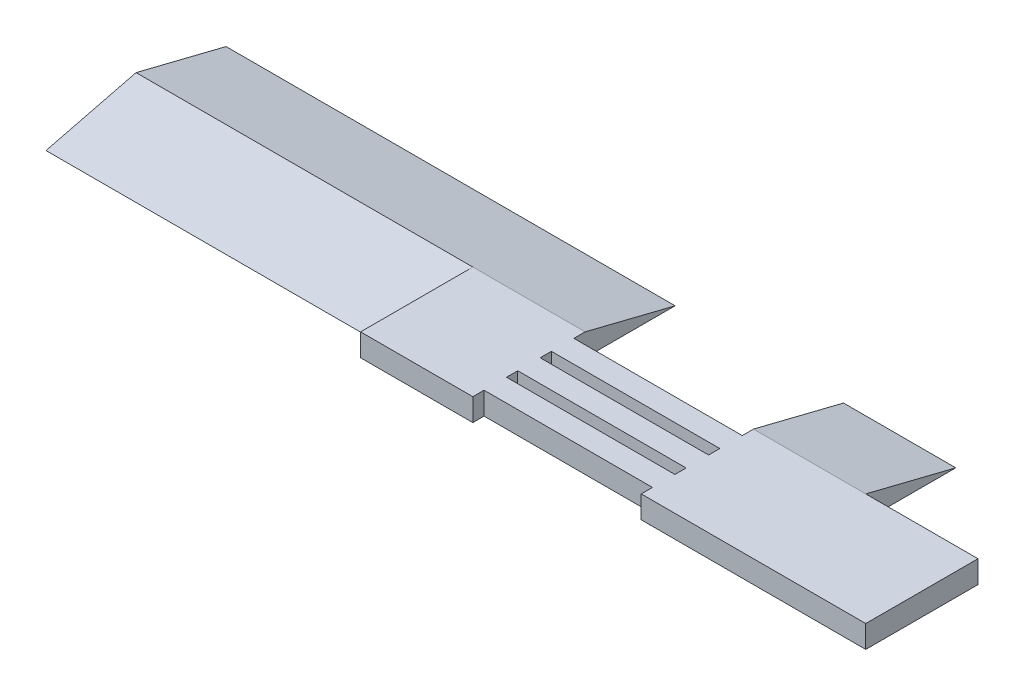
ISO-10303-21;
HEADER;
FILE_DESCRIPTION(('STEP AP214'),'2;1');
FILE_NAME('part.step','',(''),(''),'','','');
FILE_SCHEMA(('AUTOMOTIVE_DESIGN { 1 0 10303 214 1 1 1 1 }'));
ENDSEC;
DATA;
#1=APPLICATION_CONTEXT('core data for automotive mechanical design processes');
#2=APPLICATION_PROTOCOL_DEFINITION('international standard','automotive_design',2000,#1);
#3=PRODUCT_CONTEXT('',#1,'mechanical');
#4=PRODUCT('Part','Part','',(#3));
#5=PRODUCT_RELATED_PRODUCT_CATEGORY('part','',(#4));
#6=PRODUCT_DEFINITION_FORMATION('','',#4);
#7=PRODUCT_DEFINITION_CONTEXT('part definition',#1,'design');
#8=PRODUCT_DEFINITION('design','',#6,#7);
#9=PRODUCT_DEFINITION_SHAPE('','',#8);
#10=(LENGTH_UNIT() NAMED_UNIT(*) SI_UNIT(.MILLI.,.METRE.));
#11=(NAMED_UNIT(*) PLANE_ANGLE_UNIT() SI_UNIT($,.RADIAN.));
#12=(NAMED_UNIT(*) SI_UNIT($,.STERADIAN.) SOLID_ANGLE_UNIT());
#13=UNCERTAINTY_MEASURE_WITH_UNIT(LENGTH_MEASURE(1.E-05),#10,'distance_accuracy_value','');
#14=(GEOMETRIC_REPRESENTATION_CONTEXT(3) GLOBAL_UNCERTAINTY_ASSIGNED_CONTEXT((#13)) GLOBAL_UNIT_ASSIGNED_CONTEXT((#10,
#11,#12)) REPRESENTATION_CONTEXT('',''));
#15=CARTESIAN_POINT('',(0.,0.,0.));
#16=DIRECTION('',(0.,0.,1.));
#17=DIRECTION('',(1.,0.,0.));
#18=AXIS2_PLACEMENT_3D('',#15,#16,#17);
#19=CARTESIAN_POINT('',(0.,200.,0.));
#20=DIRECTION('',(1.,0.,0.));
#21=DIRECTION('',(0.,0.,-1.));
#22=AXIS2_PLACEMENT_3D('',#19,#20,#21);
#23=PLANE('',#22);
#24=DIRECTION('',(0.,1.,0.));
#25=VECTOR('',#24,1.);
#26=CARTESIAN_POINT('',(0.,200.,-700.));
#27=LINE('',#26,#25);
#28=CARTESIAN_POINT('',(0.,0.,-700.));
#29=VERTEX_POINT('',#28);
#30=CARTESIAN_POINT('',(0.,200.,-700.));
#31=VERTEX_POINT('',#30);
#32=EDGE_CURVE('E289',#29,#31,#27,.T.);
#33=ORIENTED_EDGE('',*,*,#32,.F.);
#34=DIRECTION('',(0.,0.,1.));
#35=VECTOR('',#34,1.);
#36=CARTESIAN_POINT('',(0.,0.,0.));
#37=LINE('',#36,#35);
#38=CARTESIAN_POINT('',(0.,0.,-600.));
#39=VERTEX_POINT('',#38);
#40=EDGE_CURVE('E404',#29,#39,#37,.T.);
#41=ORIENTED_EDGE('',*,*,#40,.T.);
#42=DIRECTION('',(0.,-1.,0.));
#43=VECTOR('',#42,1.);
#44=CARTESIAN_POINT('',(0.,200.,-600.));
#45=LINE('',#44,#43);
#46=CARTESIAN_POINT('',(0.,200.,-600.));
#47=VERTEX_POINT('',#46);
#48=EDGE_CURVE('E315',#47,#39,#45,.T.);
#49=ORIENTED_EDGE('',*,*,#48,.F.);
#50=DIRECTION('',(0.,0.,1.));
#51=VECTOR('',#50,1.);
#52=CARTESIAN_POINT('',(0.,200.,0.));
#53=LINE('',#52,#51);
#54=EDGE_CURVE('E68',#31,#47,#53,.T.);
#55=ORIENTED_EDGE('',*,*,#54,.F.);
#56=EDGE_LOOP('',(#33,#41,#49,#55));
#57=FACE_BOUND('',#56,.T.);
#58=ADVANCED_FACE('F45',(#57),#23,.F.);
#59=DIRECTION('',(0.,-1.,0.));
#60=VECTOR('',#59,1.);
#61=CARTESIAN_POINT('',(0.,200.,-900.));
#62=LINE('',#61,#60);
#63=CARTESIAN_POINT('',(0.,200.,-900.));
#64=VERTEX_POINT('',#63);
#65=CARTESIAN_POINT('',(0.,0.,-900.));
#66=VERTEX_POINT('',#65);
#67=EDGE_CURVE('E285',#64,#66,#62,.T.);
#68=ORIENTED_EDGE('',*,*,#67,.F.);
#69=CARTESIAN_POINT('',(0.,200.,-1000.));
#70=VERTEX_POINT('',#69);
#71=EDGE_CURVE('E384',#70,#64,#53,.T.);
#72=ORIENTED_EDGE('',*,*,#71,.F.);
#73=DIRECTION('',(0.,-0.241921895599665,-0.970295726275997));
#74=VECTOR('',#73,1.);
#75=CARTESIAN_POINT('',(0.,200.,-1000.));
#76=LINE('',#75,#74);
#77=CARTESIAN_POINT('',(0.,0.,-1802.15618670718));
#78=VERTEX_POINT('',#77);
#79=EDGE_CURVE('E359',#70,#78,#76,.T.);
#80=ORIENTED_EDGE('',*,*,#79,.T.);
#81=EDGE_CURVE('E400',#78,#66,#37,.T.);
#82=ORIENTED_EDGE('',*,*,#81,.T.);
#83=EDGE_LOOP('',(#68,#72,#80,#82));
#84=FACE_BOUND('',#83,.T.);
#85=ADVANCED_FACE('F514',(#84),#23,.F.);
#86=DIRECTION('',(0.,1.,0.));
#87=VECTOR('',#86,1.);
#88=CARTESIAN_POINT('',(0.,200.,-400.));
#89=LINE('',#88,#87);
#90=CARTESIAN_POINT('',(0.,0.,-400.));
#91=VERTEX_POINT('',#90);
#92=CARTESIAN_POINT('',(0.,200.,-400.));
#93=VERTEX_POINT('',#92);
#94=EDGE_CURVE('E319',#91,#93,#89,.T.);
#95=ORIENTED_EDGE('',*,*,#94,.F.);
#96=CARTESIAN_POINT('',(0.,0.,-300.));
#97=VERTEX_POINT('',#96);
#98=EDGE_CURVE('E433',#91,#97,#37,.T.);
#99=ORIENTED_EDGE('',*,*,#98,.T.);
#100=DIRECTION('',(0.,-1.,0.));
#101=VECTOR('',#100,1.);
#102=CARTESIAN_POINT('',(0.,200.,-300.));
#103=LINE('',#102,#101);
#104=CARTESIAN_POINT('',(0.,200.,-300.));
#105=VERTEX_POINT('',#104);
#106=EDGE_CURVE('E334',#105,#97,#103,.T.);
#107=ORIENTED_EDGE('',*,*,#106,.F.);
#108=EDGE_CURVE('E451',#93,#105,#53,.T.);
#109=ORIENTED_EDGE('',*,*,#108,.F.);
#110=EDGE_LOOP('',(#95,#99,#107,#109));
#111=FACE_BOUND('',#110,.T.);
#112=ADVANCED_FACE('F518',(#111),#23,.F.);
#113=DIRECTION('',(0.,1.,0.));
#114=VECTOR('',#113,1.);
#115=CARTESIAN_POINT('',(0.,200.,-100.));
#116=LINE('',#115,#114);
#117=CARTESIAN_POINT('',(0.,0.,-100.));
#118=VERTEX_POINT('',#117);
#119=CARTESIAN_POINT('',(0.,200.,-100.));
#120=VERTEX_POINT('',#119);
#121=EDGE_CURVE('E324',#118,#120,#116,.T.);
#122=ORIENTED_EDGE('',*,*,#121,.F.);
#123=CARTESIAN_POINT('',(0.,0.,0.));
#124=VERTEX_POINT('',#123);
#125=EDGE_CURVE('E380',#118,#124,#37,.T.);
#126=ORIENTED_EDGE('',*,*,#125,.T.);
#127=DIRECTION('',(0.,-1.,0.));
#128=VECTOR('',#127,1.);
#129=CARTESIAN_POINT('',(0.,200.,0.));
#130=LINE('',#129,#128);
#131=CARTESIAN_POINT('',(0.,200.,0.));
#132=VERTEX_POINT('',#131);
#133=EDGE_CURVE('E54',#132,#124,#130,.T.);
#134=ORIENTED_EDGE('',*,*,#133,.F.);
#135=EDGE_CURVE('E389',#120,#132,#53,.T.);
#136=ORIENTED_EDGE('',*,*,#135,.F.);
#137=EDGE_LOOP('',(#122,#126,#134,#136));
#138=FACE_BOUND('',#137,.T.);
#139=ADVANCED_FACE('F47',(#138),#23,.F.);
#140=CARTESIAN_POINT('',(0.,200.,0.));
#141=DIRECTION('',(0.,0.,-1.));
#142=DIRECTION('',(-1.,0.,0.));
#143=AXIS2_PLACEMENT_3D('',#140,#141,#142);
#144=PLANE('',#143);
#145=DIRECTION('',(1.,0.,0.));
#146=VECTOR('',#145,1.);
#147=CARTESIAN_POINT('',(0.,0.,0.));
#148=LINE('',#147,#146);
#149=CARTESIAN_POINT('',(2000.,0.,0.));
#150=VERTEX_POINT('',#149);
#151=EDGE_CURVE('E403',#124,#150,#148,.T.);
#152=ORIENTED_EDGE('',*,*,#151,.T.);
#153=DIRECTION('',(0.,-1.,0.));
#154=VECTOR('',#153,1.);
#155=CARTESIAN_POINT('',(2000.,200.,0.));
#156=LINE('',#155,#154);
#157=CARTESIAN_POINT('',(2000.,200.,0.));
#158=VERTEX_POINT('',#157);
#159=EDGE_CURVE('E417',#158,#150,#156,.T.);
#160=ORIENTED_EDGE('',*,*,#159,.F.);
#161=DIRECTION('',(1.,0.,0.));
#162=VECTOR('',#161,1.);
#163=CARTESIAN_POINT('',(0.,200.,0.));
#164=LINE('',#163,#162);
#165=EDGE_CURVE('E388',#132,#158,#164,.T.);
#166=ORIENTED_EDGE('',*,*,#165,.F.);
#167=ORIENTED_EDGE('',*,*,#133,.T.);
#168=EDGE_LOOP('',(#152,#160,#166,#167));
#169=FACE_BOUND('',#168,.T.);
#170=ADVANCED_FACE('F425',(#169),#144,.F.);
#171=CARTESIAN_POINT('',(2000.,200.,0.));
#172=DIRECTION('',(-1.,0.,0.));
#173=DIRECTION('',(0.,0.,1.));
#174=AXIS2_PLACEMENT_3D('',#171,#172,#173);
#175=PLANE('',#174);
#176=DIRECTION('',(0.,0.,-1.));
#177=VECTOR('',#176,1.);
#178=CARTESIAN_POINT('',(2000.,0.,0.));
#179=LINE('',#178,#177);
#180=CARTESIAN_POINT('',(2000.,0.,-1000.));
#181=VERTEX_POINT('',#180);
#182=EDGE_CURVE('E407',#150,#181,#179,.T.);
#183=ORIENTED_EDGE('',*,*,#182,.T.);
#184=DIRECTION('',(0.,-1.,0.));
#185=VECTOR('',#184,1.);
#186=CARTESIAN_POINT('',(2000.,200.,-1000.));
#187=LINE('',#186,#185);
#188=CARTESIAN_POINT('',(2000.,200.,-1000.));
#189=VERTEX_POINT('',#188);
#190=EDGE_CURVE('E399',#189,#181,#187,.T.);
#191=ORIENTED_EDGE('',*,*,#190,.F.);
#192=DIRECTION('',(0.,0.,-1.));
#193=VECTOR('',#192,1.);
#194=CARTESIAN_POINT('',(2000.,200.,0.));
#195=LINE('',#194,#193);
#196=EDGE_CURVE('E392',#158,#189,#195,.T.);
#197=ORIENTED_EDGE('',*,*,#196,.F.);
#198=ORIENTED_EDGE('',*,*,#159,.T.);
#199=EDGE_LOOP('',(#183,#191,#197,#198));
#200=FACE_BOUND('',#199,.T.);
#201=ADVANCED_FACE('F441',(#200),#175,.F.);
#202=CARTESIAN_POINT('',(0.,200.,-1000.));
#203=DIRECTION('',(0.,0.,1.));
#204=DIRECTION('',(1.,0.,0.));
#205=AXIS2_PLACEMENT_3D('',#202,#203,#204);
#206=PLANE('',#205);
#207=DIRECTION('',(-1.,0.,0.));
#208=VECTOR('',#207,1.);
#209=CARTESIAN_POINT('',(0.,0.,-1000.));
#210=LINE('',#209,#208);
#211=CARTESIAN_POINT('',(1000.,0.,-1000.));
#212=VERTEX_POINT('',#211);
#213=EDGE_CURVE('E410',#181,#212,#210,.T.);
#214=ORIENTED_EDGE('',*,*,#213,.T.);
#215=DIRECTION('',(0.,1.,0.));
#216=VECTOR('',#215,1.);
#217=CARTESIAN_POINT('',(1000.,200.,-1000.));
#218=LINE('',#217,#216);
#219=CARTESIAN_POINT('',(1000.,200.,-1000.));
#220=VERTEX_POINT('',#219);
#221=EDGE_CURVE('E360',#212,#220,#218,.T.);
#222=ORIENTED_EDGE('',*,*,#221,.T.);
#223=DIRECTION('',(-1.,0.,0.));
#224=VECTOR('',#223,1.);
#225=CARTESIAN_POINT('',(0.,200.,-1000.));
#226=LINE('',#225,#224);
#227=EDGE_CURVE('E395',#189,#220,#226,.T.);
#228=ORIENTED_EDGE('',*,*,#227,.F.);
#229=ORIENTED_EDGE('',*,*,#190,.T.);
#230=EDGE_LOOP('',(#214,#222,#228,#229));
#231=FACE_BOUND('',#230,.T.);
#232=ADVANCED_FACE('F445',(#231),#206,.F.);
#233=CARTESIAN_POINT('',(0.,200.,0.));
#234=DIRECTION('',(0.,-1.,0.));
#235=DIRECTION('',(0.,0.,-1.));
#236=AXIS2_PLACEMENT_3D('',#233,#234,#235);
#237=PLANE('',#236);
#238=DIRECTION('',(1.,0.,0.));
#239=VECTOR('',#238,1.);
#240=CARTESIAN_POINT('',(-1500.,200.,-300.));
#241=LINE('',#240,#239);
#242=CARTESIAN_POINT('',(-1500.,200.,-300.));
#243=VERTEX_POINT('',#242);
#244=EDGE_CURVE('E351',#243,#105,#241,.T.);
#245=ORIENTED_EDGE('',*,*,#244,.F.);
#246=DIRECTION('',(0.,0.,-1.));
#247=VECTOR('',#246,1.);
#248=CARTESIAN_POINT('',(-1500.,200.,-1000.));
#249=LINE('',#248,#247);
#250=CARTESIAN_POINT('',(-1500.,200.,-400.));
#251=VERTEX_POINT('',#250);
#252=EDGE_CURVE('E240',#243,#251,#249,.T.);
#253=ORIENTED_EDGE('',*,*,#252,.T.);
#254=DIRECTION('',(1.,0.,0.));
#255=VECTOR('',#254,1.);
#256=CARTESIAN_POINT('',(-1500.,200.,-400.));
#257=LINE('',#256,#255);
#258=EDGE_CURVE('E294',#251,#93,#257,.T.);
#259=ORIENTED_EDGE('',*,*,#258,.T.);
#260=ORIENTED_EDGE('',*,*,#108,.T.);
#261=EDGE_LOOP('',(#245,#253,#259,#260));
#262=FACE_BOUND('',#261,.T.);
#263=DIRECTION('',(1.,0.,0.));
#264=VECTOR('',#263,1.);
#265=CARTESIAN_POINT('',(-1500.,200.,-600.));
#266=LINE('',#265,#264);
#267=CARTESIAN_POINT('',(-1500.,200.,-600.));
#268=VERTEX_POINT('',#267);
#269=EDGE_CURVE('E302',#268,#47,#266,.T.);
#270=ORIENTED_EDGE('',*,*,#269,.F.);
#271=CARTESIAN_POINT('',(-1500.,200.,-700.));
#272=VERTEX_POINT('',#271);
#273=EDGE_CURVE('E467',#268,#272,#249,.T.);
#274=ORIENTED_EDGE('',*,*,#273,.T.);
#275=DIRECTION('',(1.,0.,0.));
#276=VECTOR('',#275,1.);
#277=CARTESIAN_POINT('',(-1500.,200.,-700.));
#278=LINE('',#277,#276);
#279=EDGE_CURVE('E269',#272,#31,#278,.T.);
#280=ORIENTED_EDGE('',*,*,#279,.T.);
#281=ORIENTED_EDGE('',*,*,#54,.T.);
#282=EDGE_LOOP('',(#270,#274,#280,#281));
#283=FACE_BOUND('',#282,.T.);
#284=ORIENTED_EDGE('',*,*,#71,.T.);
#285=DIRECTION('',(1.,0.,0.));
#286=VECTOR('',#285,1.);
#287=CARTESIAN_POINT('',(-1500.,200.,-900.));
#288=LINE('',#287,#286);
#289=CARTESIAN_POINT('',(-1500.,200.,-900.));
#290=VERTEX_POINT('',#289);
#291=EDGE_CURVE('E272',#290,#64,#288,.T.);
#292=ORIENTED_EDGE('',*,*,#291,.F.);
#293=CARTESIAN_POINT('',(-1500.,200.,-999.999999999999));
#294=VERTEX_POINT('',#293);
#295=EDGE_CURVE('E241',#290,#294,#249,.T.);
#296=ORIENTED_EDGE('',*,*,#295,.T.);
#297=DIRECTION('',(-1.,0.,0.));
#298=VECTOR('',#297,1.);
#299=CARTESIAN_POINT('',(-1500.,200.,-1000.));
#300=LINE('',#299,#298);
#301=CARTESIAN_POINT('',(-2500.,200.,-999.999999999999));
#302=VERTEX_POINT('',#301);
#303=EDGE_CURVE('E239',#294,#302,#300,.T.);
#304=ORIENTED_EDGE('',*,*,#303,.T.);
#305=DIRECTION('',(0.,0.,1.));
#306=VECTOR('',#305,1.);
#307=CARTESIAN_POINT('',(-2500.,200.,-1000.));
#308=LINE('',#307,#306);
#309=CARTESIAN_POINT('',(-2500.,200.,1.10007685150778E-13));
#310=VERTEX_POINT('',#309);
#311=EDGE_CURVE('E244',#302,#310,#308,.T.);
#312=ORIENTED_EDGE('',*,*,#311,.T.);
#313=DIRECTION('',(1.,0.,0.));
#314=VECTOR('',#313,1.);
#315=CARTESIAN_POINT('',(-1500.,200.,0.));
#316=LINE('',#315,#314);
#317=CARTESIAN_POINT('',(-1500.,200.,0.));
#318=VERTEX_POINT('',#317);
#319=EDGE_CURVE('E247',#310,#318,#316,.T.);
#320=ORIENTED_EDGE('',*,*,#319,.T.);
#321=CARTESIAN_POINT('',(-1500.,200.,-100.));
#322=VERTEX_POINT('',#321);
#323=EDGE_CURVE('E235',#318,#322,#249,.T.);
#324=ORIENTED_EDGE('',*,*,#323,.T.);
#325=DIRECTION('',(1.,0.,0.));
#326=VECTOR('',#325,1.);
#327=CARTESIAN_POINT('',(-1500.,200.,-100.));
#328=LINE('',#327,#326);
#329=EDGE_CURVE('E355',#322,#120,#328,.T.);
#330=ORIENTED_EDGE('',*,*,#329,.T.);
#331=ORIENTED_EDGE('',*,*,#135,.T.);
#332=ORIENTED_EDGE('',*,*,#165,.T.);
#333=ORIENTED_EDGE('',*,*,#196,.T.);
#334=ORIENTED_EDGE('',*,*,#227,.T.);
#335=DIRECTION('',(-1.,0.,0.));
#336=VECTOR('',#335,1.);
#337=CARTESIAN_POINT('',(1000.,200.,-1000.));
#338=LINE('',#337,#336);
#339=EDGE_CURVE('E372',#220,#70,#338,.T.);
#340=ORIENTED_EDGE('',*,*,#339,.T.);
#341=EDGE_LOOP('',(#284,#292,#296,#304,#312,#320,#324,#330,#331,#332,#333,#334,#340));
#342=FACE_BOUND('',#341,.T.);
#343=ADVANCED_FACE('F447',(#262,#283,#342),#237,.F.);
#344=CARTESIAN_POINT('',(0.,0.,0.));
#345=DIRECTION('',(0.,-1.,0.));
#346=DIRECTION('',(0.,0.,-1.));
#347=AXIS2_PLACEMENT_3D('',#344,#345,#346);
#348=PLANE('',#347);
#349=DIRECTION('',(0.,0.,1.));
#350=VECTOR('',#349,1.);
#351=CARTESIAN_POINT('',(-2500.,0.,-1000.));
#352=LINE('',#351,#350);
#353=CARTESIAN_POINT('',(-2500.,0.,-197.84381329282));
#354=VERTEX_POINT('',#353);
#355=CARTESIAN_POINT('',(-2500.,0.,1.10007685150778E-13));
#356=VERTEX_POINT('',#355);
#357=EDGE_CURVE('E255',#354,#356,#352,.T.);
#358=ORIENTED_EDGE('',*,*,#357,.F.);
#359=DIRECTION('',(1.,0.,0.));
#360=VECTOR('',#359,1.);
#361=CARTESIAN_POINT('',(-5500.,0.,-197.843813292819));
#362=LINE('',#361,#360);
#363=CARTESIAN_POINT('',(-5500.,0.,-197.843813292819));
#364=VERTEX_POINT('',#363);
#365=EDGE_CURVE('E61',#364,#354,#362,.T.);
#366=ORIENTED_EDGE('',*,*,#365,.F.);
#367=DIRECTION('',(0.,0.,-1.));
#368=VECTOR('',#367,1.);
#369=CARTESIAN_POINT('',(-5500.,0.,-1802.15618670718));
#370=LINE('',#369,#368);
#371=CARTESIAN_POINT('',(-5500.,0.,-1802.15618670718));
#372=VERTEX_POINT('',#371);
#373=EDGE_CURVE('E208',#364,#372,#370,.T.);
#374=ORIENTED_EDGE('',*,*,#373,.T.);
#375=DIRECTION('',(1.,0.,0.));
#376=VECTOR('',#375,1.);
#377=CARTESIAN_POINT('',(-5500.,0.,-1802.15618670718));
#378=LINE('',#377,#376);
#379=CARTESIAN_POINT('',(-1500.,0.,-1802.15618670718));
#380=VERTEX_POINT('',#379);
#381=EDGE_CURVE('E220',#372,#380,#378,.T.);
#382=ORIENTED_EDGE('',*,*,#381,.T.);
#383=DIRECTION('',(0.,0.,-1.));
#384=VECTOR('',#383,1.);
#385=CARTESIAN_POINT('',(-1500.,0.,-1000.));
#386=LINE('',#385,#384);
#387=CARTESIAN_POINT('',(-1500.,0.,-900.));
#388=VERTEX_POINT('',#387);
#389=EDGE_CURVE('E232',#388,#380,#386,.T.);
#390=ORIENTED_EDGE('',*,*,#389,.F.);
#391=DIRECTION('',(1.,0.,0.));
#392=VECTOR('',#391,1.);
#393=CARTESIAN_POINT('',(-1500.,0.,-900.));
#394=LINE('',#393,#392);
#395=EDGE_CURVE('E276',#388,#66,#394,.T.);
#396=ORIENTED_EDGE('',*,*,#395,.T.);
#397=ORIENTED_EDGE('',*,*,#81,.F.);
#398=DIRECTION('',(-1.,0.,0.));
#399=VECTOR('',#398,1.);
#400=CARTESIAN_POINT('',(1000.,0.,-1802.15618670718));
#401=LINE('',#400,#399);
#402=CARTESIAN_POINT('',(1000.,0.,-1802.15618670718));
#403=VERTEX_POINT('',#402);
#404=EDGE_CURVE('E376',#403,#78,#401,.T.);
#405=ORIENTED_EDGE('',*,*,#404,.F.);
#406=DIRECTION('',(0.,0.,1.));
#407=VECTOR('',#406,1.);
#408=CARTESIAN_POINT('',(1000.,0.,-1000.));
#409=LINE('',#408,#407);
#410=EDGE_CURVE('E368',#403,#212,#409,.T.);
#411=ORIENTED_EDGE('',*,*,#410,.T.);
#412=ORIENTED_EDGE('',*,*,#213,.F.);
#413=ORIENTED_EDGE('',*,*,#182,.F.);
#414=ORIENTED_EDGE('',*,*,#151,.F.);
#415=ORIENTED_EDGE('',*,*,#125,.F.);
#416=DIRECTION('',(1.,0.,0.));
#417=VECTOR('',#416,1.);
#418=CARTESIAN_POINT('',(-1500.,0.,-100.));
#419=LINE('',#418,#417);
#420=CARTESIAN_POINT('',(-1500.,0.,-100.));
#421=VERTEX_POINT('',#420);
#422=EDGE_CURVE('E337',#421,#118,#419,.T.);
#423=ORIENTED_EDGE('',*,*,#422,.F.);
#424=CARTESIAN_POINT('',(-1500.,0.,0.));
#425=VERTEX_POINT('',#424);
#426=EDGE_CURVE('E251',#425,#421,#386,.T.);
#427=ORIENTED_EDGE('',*,*,#426,.F.);
#428=DIRECTION('',(1.,0.,0.));
#429=VECTOR('',#428,1.);
#430=CARTESIAN_POINT('',(-1500.,0.,0.));
#431=LINE('',#430,#429);
#432=EDGE_CURVE('E259',#356,#425,#431,.T.);
#433=ORIENTED_EDGE('',*,*,#432,.F.);
#434=EDGE_LOOP('',(#358,#366,#374,#382,#390,#396,#397,#405,#411,#412,#413,#414,#415,#423,#427,#433));
#435=FACE_BOUND('',#434,.T.);
#436=CARTESIAN_POINT('',(-1500.,0.,-300.));
#437=VERTEX_POINT('',#436);
#438=CARTESIAN_POINT('',(-1500.,0.,-400.));
#439=VERTEX_POINT('',#438);
#440=EDGE_CURVE('E256',#437,#439,#386,.T.);
#441=ORIENTED_EDGE('',*,*,#440,.F.);
#442=DIRECTION('',(1.,0.,0.));
#443=VECTOR('',#442,1.);
#444=CARTESIAN_POINT('',(-1500.,0.,-300.));
#445=LINE('',#444,#443);
#446=EDGE_CURVE('E347',#437,#97,#445,.T.);
#447=ORIENTED_EDGE('',*,*,#446,.T.);
#448=ORIENTED_EDGE('',*,*,#98,.F.);
#449=DIRECTION('',(1.,0.,0.));
#450=VECTOR('',#449,1.);
#451=CARTESIAN_POINT('',(-1500.,0.,-400.));
#452=LINE('',#451,#450);
#453=EDGE_CURVE('E310',#439,#91,#452,.T.);
#454=ORIENTED_EDGE('',*,*,#453,.F.);
#455=EDGE_LOOP('',(#441,#447,#448,#454));
#456=FACE_BOUND('',#455,.T.);
#457=CARTESIAN_POINT('',(-1500.,0.,-600.));
#458=VERTEX_POINT('',#457);
#459=CARTESIAN_POINT('',(-1500.,0.,-700.));
#460=VERTEX_POINT('',#459);
#461=EDGE_CURVE('E482',#458,#460,#386,.T.);
#462=ORIENTED_EDGE('',*,*,#461,.F.);
#463=DIRECTION('',(1.,0.,0.));
#464=VECTOR('',#463,1.);
#465=CARTESIAN_POINT('',(-1500.,0.,-600.));
#466=LINE('',#465,#464);
#467=EDGE_CURVE('E306',#458,#39,#466,.T.);
#468=ORIENTED_EDGE('',*,*,#467,.T.);
#469=ORIENTED_EDGE('',*,*,#40,.F.);
#470=DIRECTION('',(1.,0.,0.));
#471=VECTOR('',#470,1.);
#472=CARTESIAN_POINT('',(-1500.,0.,-700.));
#473=LINE('',#472,#471);
#474=EDGE_CURVE('E280',#460,#29,#473,.T.);
#475=ORIENTED_EDGE('',*,*,#474,.F.);
#476=EDGE_LOOP('',(#462,#468,#469,#475));
#477=FACE_BOUND('',#476,.T.);
#478=ADVANCED_FACE('F436',(#435,#456,#477),#348,.T.);
#479=CARTESIAN_POINT('',(1000.,200.,-1000.));
#480=DIRECTION('',(0.,0.970295726275997,-0.241921895599665));
#481=DIRECTION('',(0.,0.241921895599665,0.970295726275997));
#482=AXIS2_PLACEMENT_3D('',#479,#480,#481);
#483=PLANE('',#482);
#484=ORIENTED_EDGE('',*,*,#79,.F.);
#485=ORIENTED_EDGE('',*,*,#339,.F.);
#486=DIRECTION('',(0.,-0.241921895599665,-0.970295726275997));
#487=VECTOR('',#486,1.);
#488=CARTESIAN_POINT('',(1000.,200.,-1000.));
#489=LINE('',#488,#487);
#490=EDGE_CURVE('E364',#220,#403,#489,.T.);
#491=ORIENTED_EDGE('',*,*,#490,.T.);
#492=ORIENTED_EDGE('',*,*,#404,.T.);
#493=EDGE_LOOP('',(#484,#485,#491,#492));
#494=FACE_BOUND('',#493,.T.);
#495=ADVANCED_FACE('F510',(#494),#483,.T.);
#496=CARTESIAN_POINT('',(1000.,0.,0.));
#497=DIRECTION('',(1.,0.,0.));
#498=DIRECTION('',(0.,0.,-1.));
#499=AXIS2_PLACEMENT_3D('',#496,#497,#498);
#500=PLANE('',#499);
#501=ORIENTED_EDGE('',*,*,#221,.F.);
#502=ORIENTED_EDGE('',*,*,#410,.F.);
#503=ORIENTED_EDGE('',*,*,#490,.F.);
#504=EDGE_LOOP('',(#501,#502,#503));
#505=FACE_BOUND('',#504,.T.);
#506=ADVANCED_FACE('F499',(#505),#500,.T.);
#507=CARTESIAN_POINT('',(-1500.,200.,-100.));
#508=DIRECTION('',(0.,0.,-1.));
#509=DIRECTION('',(-1.,0.,0.));
#510=AXIS2_PLACEMENT_3D('',#507,#508,#509);
#511=PLANE('',#510);
#512=ORIENTED_EDGE('',*,*,#121,.T.);
#513=ORIENTED_EDGE('',*,*,#329,.F.);
#514=DIRECTION('',(0.,1.,0.));
#515=VECTOR('',#514,1.);
#516=CARTESIAN_POINT('',(-1500.,200.,-100.));
#517=LINE('',#516,#515);
#518=EDGE_CURVE('E329',#421,#322,#517,.T.);
#519=ORIENTED_EDGE('',*,*,#518,.F.);
#520=ORIENTED_EDGE('',*,*,#422,.T.);
#521=EDGE_LOOP('',(#512,#513,#519,#520));
#522=FACE_BOUND('',#521,.T.);
#523=ADVANCED_FACE('F496',(#522),#511,.F.);
#524=CARTESIAN_POINT('',(-1500.,200.,-300.));
#525=DIRECTION('',(0.,0.,1.));
#526=DIRECTION('',(1.,0.,0.));
#527=AXIS2_PLACEMENT_3D('',#524,#525,#526);
#528=PLANE('',#527);
#529=ORIENTED_EDGE('',*,*,#106,.T.);
#530=ORIENTED_EDGE('',*,*,#446,.F.);
#531=DIRECTION('',(0.,-1.,0.));
#532=VECTOR('',#531,1.);
#533=CARTESIAN_POINT('',(-1500.,200.,-300.));
#534=LINE('',#533,#532);
#535=EDGE_CURVE('E333',#243,#437,#534,.T.);
#536=ORIENTED_EDGE('',*,*,#535,.F.);
#537=ORIENTED_EDGE('',*,*,#244,.T.);
#538=EDGE_LOOP('',(#529,#530,#536,#537));
#539=FACE_BOUND('',#538,.T.);
#540=ADVANCED_FACE('F498',(#539),#528,.F.);
#541=CARTESIAN_POINT('',(-1500.,200.,-400.));
#542=DIRECTION('',(0.,0.,-1.));
#543=DIRECTION('',(-1.,0.,0.));
#544=AXIS2_PLACEMENT_3D('',#541,#542,#543);
#545=PLANE('',#544);
#546=ORIENTED_EDGE('',*,*,#94,.T.);
#547=ORIENTED_EDGE('',*,*,#258,.F.);
#548=DIRECTION('',(0.,1.,0.));
#549=VECTOR('',#548,1.);
#550=CARTESIAN_POINT('',(-1500.,200.,-400.));
#551=LINE('',#550,#549);
#552=EDGE_CURVE('E320',#439,#251,#551,.T.);
#553=ORIENTED_EDGE('',*,*,#552,.F.);
#554=ORIENTED_EDGE('',*,*,#453,.T.);
#555=EDGE_LOOP('',(#546,#547,#553,#554));
#556=FACE_BOUND('',#555,.T.);
#557=ADVANCED_FACE('F506',(#556),#545,.F.);
#558=CARTESIAN_POINT('',(-1500.,200.,-600.));
#559=DIRECTION('',(0.,0.,1.));
#560=DIRECTION('',(1.,0.,0.));
#561=AXIS2_PLACEMENT_3D('',#558,#559,#560);
#562=PLANE('',#561);
#563=ORIENTED_EDGE('',*,*,#48,.T.);
#564=ORIENTED_EDGE('',*,*,#467,.F.);
#565=DIRECTION('',(0.,-1.,0.));
#566=VECTOR('',#565,1.);
#567=CARTESIAN_POINT('',(-1500.,200.,-600.));
#568=LINE('',#567,#566);
#569=EDGE_CURVE('E314',#268,#458,#568,.T.);
#570=ORIENTED_EDGE('',*,*,#569,.F.);
#571=ORIENTED_EDGE('',*,*,#269,.T.);
#572=EDGE_LOOP('',(#563,#564,#570,#571));
#573=FACE_BOUND('',#572,.T.);
#574=ADVANCED_FACE('F462',(#573),#562,.F.);
#575=CARTESIAN_POINT('',(-1500.,200.,-700.));
#576=DIRECTION('',(0.,0.,-1.));
#577=DIRECTION('',(-1.,0.,0.));
#578=AXIS2_PLACEMENT_3D('',#575,#576,#577);
#579=PLANE('',#578);
#580=ORIENTED_EDGE('',*,*,#32,.T.);
#581=ORIENTED_EDGE('',*,*,#279,.F.);
#582=DIRECTION('',(0.,1.,0.));
#583=VECTOR('',#582,1.);
#584=CARTESIAN_POINT('',(-1500.,200.,-700.));
#585=LINE('',#584,#583);
#586=EDGE_CURVE('E290',#460,#272,#585,.T.);
#587=ORIENTED_EDGE('',*,*,#586,.F.);
#588=ORIENTED_EDGE('',*,*,#474,.T.);
#589=EDGE_LOOP('',(#580,#581,#587,#588));
#590=FACE_BOUND('',#589,.T.);
#591=ADVANCED_FACE('F543',(#590),#579,.F.);
#592=CARTESIAN_POINT('',(-1500.,200.,-900.));
#593=DIRECTION('',(0.,0.,1.));
#594=DIRECTION('',(1.,0.,0.));
#595=AXIS2_PLACEMENT_3D('',#592,#593,#594);
#596=PLANE('',#595);
#597=ORIENTED_EDGE('',*,*,#67,.T.);
#598=ORIENTED_EDGE('',*,*,#395,.F.);
#599=DIRECTION('',(0.,-1.,0.));
#600=VECTOR('',#599,1.);
#601=CARTESIAN_POINT('',(-1500.,200.,-900.));
#602=LINE('',#601,#600);
#603=EDGE_CURVE('E284',#290,#388,#602,.T.);
#604=ORIENTED_EDGE('',*,*,#603,.F.);
#605=ORIENTED_EDGE('',*,*,#291,.T.);
#606=EDGE_LOOP('',(#597,#598,#604,#605));
#607=FACE_BOUND('',#606,.T.);
#608=ADVANCED_FACE('F545',(#607),#596,.F.);
#609=CARTESIAN_POINT('',(-1500.,200.,-1000.));
#610=DIRECTION('',(-1.,0.,0.));
#611=DIRECTION('',(0.,0.,1.));
#612=AXIS2_PLACEMENT_3D('',#609,#610,#611);
#613=PLANE('',#612);
#614=ORIENTED_EDGE('',*,*,#426,.T.);
#615=ORIENTED_EDGE('',*,*,#518,.T.);
#616=ORIENTED_EDGE('',*,*,#323,.F.);
#617=DIRECTION('',(0.,-1.,0.));
#618=VECTOR('',#617,1.);
#619=CARTESIAN_POINT('',(-1500.,200.,0.));
#620=LINE('',#619,#618);
#621=EDGE_CURVE('E250',#318,#425,#620,.T.);
#622=ORIENTED_EDGE('',*,*,#621,.T.);
#623=EDGE_LOOP('',(#614,#615,#616,#622));
#624=FACE_BOUND('',#623,.T.);
#625=ADVANCED_FACE('F494',(#624),#613,.F.);
#626=ORIENTED_EDGE('',*,*,#535,.T.);
#627=ORIENTED_EDGE('',*,*,#440,.T.);
#628=ORIENTED_EDGE('',*,*,#552,.T.);
#629=ORIENTED_EDGE('',*,*,#252,.F.);
#630=EDGE_LOOP('',(#626,#627,#628,#629));
#631=FACE_BOUND('',#630,.T.);
#632=ADVANCED_FACE('F535',(#631),#613,.F.);
#633=ORIENTED_EDGE('',*,*,#569,.T.);
#634=ORIENTED_EDGE('',*,*,#461,.T.);
#635=ORIENTED_EDGE('',*,*,#586,.T.);
#636=ORIENTED_EDGE('',*,*,#273,.F.);
#637=EDGE_LOOP('',(#633,#634,#635,#636));
#638=FACE_BOUND('',#637,.T.);
#639=ADVANCED_FACE('F468',(#638),#613,.F.);
#640=ORIENTED_EDGE('',*,*,#603,.T.);
#641=ORIENTED_EDGE('',*,*,#389,.T.);
#642=DIRECTION('',(0.,0.241921895599665,0.970295726275997));
#643=VECTOR('',#642,1.);
#644=CARTESIAN_POINT('',(-1500.,200.,-999.999999999999));
#645=LINE('',#644,#643);
#646=EDGE_CURVE('E222',#380,#294,#645,.T.);
#647=ORIENTED_EDGE('',*,*,#646,.T.);
#648=ORIENTED_EDGE('',*,*,#295,.F.);
#649=EDGE_LOOP('',(#640,#641,#647,#648));
#650=FACE_BOUND('',#649,.T.);
#651=ADVANCED_FACE('F478',(#650),#613,.F.);
#652=CARTESIAN_POINT('',(-2500.,200.,-1000.));
#653=DIRECTION('',(1.,0.,0.));
#654=DIRECTION('',(0.,0.,-1.));
#655=AXIS2_PLACEMENT_3D('',#652,#653,#654);
#656=PLANE('',#655);
#657=ORIENTED_EDGE('',*,*,#311,.F.);
#658=DIRECTION('',(0.,-0.241921895599665,0.970295726275997));
#659=VECTOR('',#658,1.);
#660=CARTESIAN_POINT('',(-2500.,200.,-1000.));
#661=LINE('',#660,#659);
#662=EDGE_CURVE('E11',#302,#354,#661,.T.);
#663=ORIENTED_EDGE('',*,*,#662,.T.);
#664=ORIENTED_EDGE('',*,*,#357,.T.);
#665=DIRECTION('',(0.,-1.,0.));
#666=VECTOR('',#665,1.);
#667=CARTESIAN_POINT('',(-2500.,200.,1.10007685150778E-13));
#668=LINE('',#667,#666);
#669=EDGE_CURVE('E265',#310,#356,#668,.T.);
#670=ORIENTED_EDGE('',*,*,#669,.F.);
#671=EDGE_LOOP('',(#657,#663,#664,#670));
#672=FACE_BOUND('',#671,.T.);
#673=ADVANCED_FACE('F487',(#672),#656,.F.);
#674=CARTESIAN_POINT('',(-1500.,200.,0.));
#675=DIRECTION('',(0.,0.,-1.));
#676=DIRECTION('',(-1.,0.,0.));
#677=AXIS2_PLACEMENT_3D('',#674,#675,#676);
#678=PLANE('',#677);
#679=ORIENTED_EDGE('',*,*,#432,.T.);
#680=ORIENTED_EDGE('',*,*,#621,.F.);
#681=ORIENTED_EDGE('',*,*,#319,.F.);
#682=ORIENTED_EDGE('',*,*,#669,.T.);
#683=EDGE_LOOP('',(#679,#680,#681,#682));
#684=FACE_BOUND('',#683,.T.);
#685=ADVANCED_FACE('F490',(#684),#678,.F.);
#686=CARTESIAN_POINT('',(-5500.,200.,-999.999999999999));
#687=DIRECTION('',(0.,0.970295726275997,0.241921895599665));
#688=DIRECTION('',(0.,-0.241921895599665,0.970295726275997));
#689=AXIS2_PLACEMENT_3D('',#686,#687,#688);
#690=PLANE('',#689);
#691=ORIENTED_EDGE('',*,*,#662,.F.);
#692=DIRECTION('',(1.,0.,0.));
#693=VECTOR('',#692,1.);
#694=CARTESIAN_POINT('',(-5500.,200.,-999.999999999999));
#695=LINE('',#694,#693);
#696=CARTESIAN_POINT('',(-5500.,200.,-999.999999999999));
#697=VERTEX_POINT('',#696);
#698=EDGE_CURVE('E199',#697,#302,#695,.T.);
#699=ORIENTED_EDGE('',*,*,#698,.F.);
#700=DIRECTION('',(0.,-0.241921895599665,0.970295726275997));
#701=VECTOR('',#700,1.);
#702=CARTESIAN_POINT('',(-5500.,200.,-999.999999999999));
#703=LINE('',#702,#701);
#704=EDGE_CURVE('E202',#697,#364,#703,.T.);
#705=ORIENTED_EDGE('',*,*,#704,.T.);
#706=ORIENTED_EDGE('',*,*,#365,.T.);
#707=EDGE_LOOP('',(#691,#699,#705,#706));
#708=FACE_BOUND('',#707,.T.);
#709=ADVANCED_FACE('F201',(#708),#690,.T.);
#710=CARTESIAN_POINT('',(-5500.,200.,-999.999999999999));
#711=DIRECTION('',(0.,0.970295726275997,-0.241921895599665));
#712=DIRECTION('',(0.,0.241921895599665,0.970295726275997));
#713=AXIS2_PLACEMENT_3D('',#710,#711,#712);
#714=PLANE('',#713);
#715=ORIENTED_EDGE('',*,*,#646,.F.);
#716=ORIENTED_EDGE('',*,*,#381,.F.);
#717=DIRECTION('',(0.,0.241921895599665,0.970295726275997));
#718=VECTOR('',#717,1.);
#719=CARTESIAN_POINT('',(-5500.,200.,-999.999999999999));
#720=LINE('',#719,#718);
#721=EDGE_CURVE('E213',#372,#697,#720,.T.);
#722=ORIENTED_EDGE('',*,*,#721,.T.);
#723=ORIENTED_EDGE('',*,*,#698,.T.);
#724=ORIENTED_EDGE('',*,*,#303,.F.);
#725=EDGE_LOOP('',(#715,#716,#722,#723,#724));
#726=FACE_BOUND('',#725,.T.);
#727=ADVANCED_FACE('F218',(#726),#714,.T.);
#728=CARTESIAN_POINT('',(-5500.,0.,1.30339295386058E-12));
#729=DIRECTION('',(-1.,0.,0.));
#730=DIRECTION('',(0.,0.,1.));
#731=AXIS2_PLACEMENT_3D('',#728,#729,#730);
#732=PLANE('',#731);
#733=ORIENTED_EDGE('',*,*,#721,.F.);
#734=ORIENTED_EDGE('',*,*,#373,.F.);
#735=ORIENTED_EDGE('',*,*,#704,.F.);
#736=EDGE_LOOP('',(#733,#734,#735));
#737=FACE_BOUND('',#736,.T.);
#738=ADVANCED_FACE('F212',(#737),#732,.T.);
#739=CLOSED_SHELL('',(#58,#85,#112,#139,#170,#201,#232,#343,#478,#495,#506,#523,#540,#557,#574,
#591,#608,#625,#632,#639,#651,#673,#685,#709,#727,#738));
#740=MANIFOLD_SOLID_BREP('B2',#739);
#741=ADVANCED_BREP_SHAPE_REPRESENTATION('',(#18,#740),#14);
#742=SHAPE_DEFINITION_REPRESENTATION(#9,#741);
ENDSEC;
END-ISO-10303-21;
